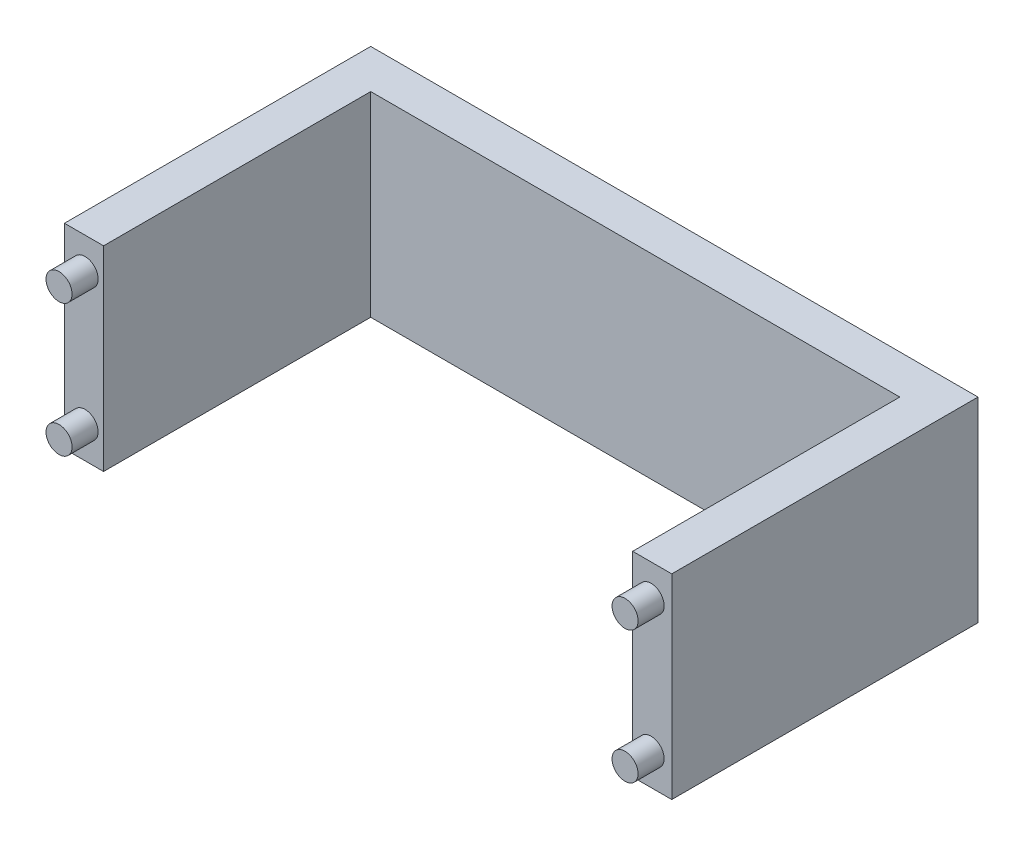
ISO-10303-21;
HEADER;
FILE_DESCRIPTION(('STEP AP214'),'2;1');
FILE_NAME('part.step','',(''),(''),'','','');
FILE_SCHEMA(('AUTOMOTIVE_DESIGN { 1 0 10303 214 1 1 1 1 }'));
ENDSEC;
DATA;
#1=APPLICATION_CONTEXT('core data for automotive mechanical design processes');
#2=APPLICATION_PROTOCOL_DEFINITION('international standard','automotive_design',2000,#1);
#3=PRODUCT_CONTEXT('',#1,'mechanical');
#4=PRODUCT('Part','Part','',(#3));
#5=PRODUCT_RELATED_PRODUCT_CATEGORY('part','',(#4));
#6=PRODUCT_DEFINITION_FORMATION('','',#4);
#7=PRODUCT_DEFINITION_CONTEXT('part definition',#1,'design');
#8=PRODUCT_DEFINITION('design','',#6,#7);
#9=PRODUCT_DEFINITION_SHAPE('','',#8);
#10=(LENGTH_UNIT() NAMED_UNIT(*) SI_UNIT(.MILLI.,.METRE.));
#11=(NAMED_UNIT(*) PLANE_ANGLE_UNIT() SI_UNIT($,.RADIAN.));
#12=(NAMED_UNIT(*) SI_UNIT($,.STERADIAN.) SOLID_ANGLE_UNIT());
#13=UNCERTAINTY_MEASURE_WITH_UNIT(LENGTH_MEASURE(1.E-05),#10,'distance_accuracy_value','');
#14=(GEOMETRIC_REPRESENTATION_CONTEXT(3) GLOBAL_UNCERTAINTY_ASSIGNED_CONTEXT((#13)) GLOBAL_UNIT_ASSIGNED_CONTEXT((#10,
#11,#12)) REPRESENTATION_CONTEXT('',''));
#15=CARTESIAN_POINT('',(0.,0.,0.));
#16=DIRECTION('',(0.,0.,1.));
#17=DIRECTION('',(1.,0.,0.));
#18=AXIS2_PLACEMENT_3D('',#15,#16,#17);
#19=CARTESIAN_POINT('',(3.,15.,0.));
#20=DIRECTION('',(0.,0.,-1.));
#21=DIRECTION('',(-1.,0.,0.));
#22=AXIS2_PLACEMENT_3D('',#19,#20,#21);
#23=PLANE('',#22);
#24=CARTESIAN_POINT('',(1.58299999999999,2.42,0.));
#25=DIRECTION('',(0.,0.,-1.));
#26=DIRECTION('',(-1.,0.,0.));
#27=AXIS2_PLACEMENT_3D('',#24,#25,#26);
#28=CIRCLE('',#27,1.);
#29=CARTESIAN_POINT('',(0.58299999999999,2.42,0.));
#30=VERTEX_POINT('',#29);
#31=EDGE_CURVE('E163',#30,#30,#28,.F.);
#32=ORIENTED_EDGE('',*,*,#31,.F.);
#33=EDGE_LOOP('',(#32));
#34=FACE_BOUND('',#33,.T.);
#35=CARTESIAN_POINT('',(1.58299999999999,12.58,0.));
#36=DIRECTION('',(0.,0.,-1.));
#37=DIRECTION('',(-1.,0.,0.));
#38=AXIS2_PLACEMENT_3D('',#35,#36,#37);
#39=CIRCLE('',#38,1.);
#40=CARTESIAN_POINT('',(0.58299999999999,12.58,0.));
#41=VERTEX_POINT('',#40);
#42=EDGE_CURVE('E160',#41,#41,#39,.F.);
#43=ORIENTED_EDGE('',*,*,#42,.F.);
#44=EDGE_LOOP('',(#43));
#45=FACE_BOUND('',#44,.T.);
#46=DIRECTION('',(1.,0.,0.));
#47=VECTOR('',#46,1.);
#48=CARTESIAN_POINT('',(3.,0.,0.));
#49=LINE('',#48,#47);
#50=CARTESIAN_POINT('',(0.,0.,0.));
#51=VERTEX_POINT('',#50);
#52=CARTESIAN_POINT('',(3.,0.,0.));
#53=VERTEX_POINT('',#52);
#54=EDGE_CURVE('E130',#51,#53,#49,.T.);
#55=ORIENTED_EDGE('',*,*,#54,.T.);
#56=DIRECTION('',(0.,-1.,0.));
#57=VECTOR('',#56,1.);
#58=CARTESIAN_POINT('',(3.,15.,0.));
#59=LINE('',#58,#57);
#60=CARTESIAN_POINT('',(3.,15.,0.));
#61=VERTEX_POINT('',#60);
#62=EDGE_CURVE('E158',#61,#53,#59,.T.);
#63=ORIENTED_EDGE('',*,*,#62,.F.);
#64=DIRECTION('',(1.,0.,0.));
#65=VECTOR('',#64,1.);
#66=CARTESIAN_POINT('',(3.,15.,0.));
#67=LINE('',#66,#65);
#68=CARTESIAN_POINT('',(0.,15.,0.));
#69=VERTEX_POINT('',#68);
#70=EDGE_CURVE('E145',#69,#61,#67,.T.);
#71=ORIENTED_EDGE('',*,*,#70,.F.);
#72=DIRECTION('',(0.,-1.,0.));
#73=VECTOR('',#72,1.);
#74=CARTESIAN_POINT('',(0.,15.,0.));
#75=LINE('',#74,#73);
#76=EDGE_CURVE('E126',#69,#51,#75,.T.);
#77=ORIENTED_EDGE('',*,*,#76,.T.);
#78=EDGE_LOOP('',(#55,#63,#71,#77));
#79=FACE_BOUND('',#78,.T.);
#80=ADVANCED_FACE('F33',(#34,#45,#79),#23,.F.);
#81=CARTESIAN_POINT('',(3.,15.,-20.5));
#82=DIRECTION('',(-1.,0.,0.));
#83=DIRECTION('',(0.,0.,1.));
#84=AXIS2_PLACEMENT_3D('',#81,#82,#83);
#85=PLANE('',#84);
#86=DIRECTION('',(0.,0.,-1.));
#87=VECTOR('',#86,1.);
#88=CARTESIAN_POINT('',(3.,0.,-20.5));
#89=LINE('',#88,#87);
#90=CARTESIAN_POINT('',(3.,0.,-20.5));
#91=VERTEX_POINT('',#90);
#92=EDGE_CURVE('E133',#53,#91,#89,.T.);
#93=ORIENTED_EDGE('',*,*,#92,.T.);
#94=DIRECTION('',(0.,-1.,0.));
#95=VECTOR('',#94,1.);
#96=CARTESIAN_POINT('',(3.,15.,-20.5));
#97=LINE('',#96,#95);
#98=CARTESIAN_POINT('',(3.,15.,-20.5));
#99=VERTEX_POINT('',#98);
#100=EDGE_CURVE('E155',#99,#91,#97,.T.);
#101=ORIENTED_EDGE('',*,*,#100,.F.);
#102=DIRECTION('',(0.,0.,-1.));
#103=VECTOR('',#102,1.);
#104=CARTESIAN_POINT('',(3.,15.,-20.5));
#105=LINE('',#104,#103);
#106=EDGE_CURVE('E93',#61,#99,#105,.T.);
#107=ORIENTED_EDGE('',*,*,#106,.F.);
#108=ORIENTED_EDGE('',*,*,#62,.T.);
#109=EDGE_LOOP('',(#93,#101,#107,#108));
#110=FACE_BOUND('',#109,.T.);
#111=ADVANCED_FACE('F197',(#110),#85,.F.);
#112=CARTESIAN_POINT('',(43.6,15.,-20.5));
#113=DIRECTION('',(0.,0.,-1.));
#114=DIRECTION('',(-1.,0.,0.));
#115=AXIS2_PLACEMENT_3D('',#112,#113,#114);
#116=PLANE('',#115);
#117=DIRECTION('',(1.,0.,0.));
#118=VECTOR('',#117,1.);
#119=CARTESIAN_POINT('',(43.6,0.,-20.5));
#120=LINE('',#119,#118);
#121=CARTESIAN_POINT('',(43.6,0.,-20.5));
#122=VERTEX_POINT('',#121);
#123=EDGE_CURVE('E136',#91,#122,#120,.T.);
#124=ORIENTED_EDGE('',*,*,#123,.T.);
#125=DIRECTION('',(0.,-1.,0.));
#126=VECTOR('',#125,1.);
#127=CARTESIAN_POINT('',(43.6,15.,-20.5));
#128=LINE('',#127,#126);
#129=CARTESIAN_POINT('',(43.6,15.,-20.5));
#130=VERTEX_POINT('',#129);
#131=EDGE_CURVE('E152',#130,#122,#128,.T.);
#132=ORIENTED_EDGE('',*,*,#131,.F.);
#133=DIRECTION('',(1.,0.,0.));
#134=VECTOR('',#133,1.);
#135=CARTESIAN_POINT('',(43.6,15.,-20.5));
#136=LINE('',#135,#134);
#137=EDGE_CURVE('E262',#99,#130,#136,.T.);
#138=ORIENTED_EDGE('',*,*,#137,.F.);
#139=ORIENTED_EDGE('',*,*,#100,.T.);
#140=EDGE_LOOP('',(#124,#132,#138,#139));
#141=FACE_BOUND('',#140,.T.);
#142=ADVANCED_FACE('F203',(#141),#116,.F.);
#143=CARTESIAN_POINT('',(43.6,15.,0.));
#144=DIRECTION('',(1.,0.,0.));
#145=DIRECTION('',(0.,0.,-1.));
#146=AXIS2_PLACEMENT_3D('',#143,#144,#145);
#147=PLANE('',#146);
#148=DIRECTION('',(0.,0.,1.));
#149=VECTOR('',#148,1.);
#150=CARTESIAN_POINT('',(43.6,0.,0.));
#151=LINE('',#150,#149);
#152=CARTESIAN_POINT('',(43.6,0.,0.));
#153=VERTEX_POINT('',#152);
#154=EDGE_CURVE('E138',#122,#153,#151,.T.);
#155=ORIENTED_EDGE('',*,*,#154,.T.);
#156=DIRECTION('',(0.,-1.,0.));
#157=VECTOR('',#156,1.);
#158=CARTESIAN_POINT('',(43.6,15.,0.));
#159=LINE('',#158,#157);
#160=CARTESIAN_POINT('',(43.6,15.,0.));
#161=VERTEX_POINT('',#160);
#162=EDGE_CURVE('E149',#161,#153,#159,.T.);
#163=ORIENTED_EDGE('',*,*,#162,.F.);
#164=DIRECTION('',(0.,0.,1.));
#165=VECTOR('',#164,1.);
#166=CARTESIAN_POINT('',(43.6,15.,0.));
#167=LINE('',#166,#165);
#168=EDGE_CURVE('E264',#130,#161,#167,.T.);
#169=ORIENTED_EDGE('',*,*,#168,.F.);
#170=ORIENTED_EDGE('',*,*,#131,.T.);
#171=EDGE_LOOP('',(#155,#163,#169,#170));
#172=FACE_BOUND('',#171,.T.);
#173=ADVANCED_FACE('F173',(#172),#147,.F.);
#174=CARTESIAN_POINT('',(46.6,15.,0.));
#175=DIRECTION('',(0.,0.,-1.));
#176=DIRECTION('',(-1.,0.,0.));
#177=AXIS2_PLACEMENT_3D('',#174,#175,#176);
#178=PLANE('',#177);
#179=CARTESIAN_POINT('',(45.017,12.58,0.));
#180=DIRECTION('',(0.,0.,-1.));
#181=DIRECTION('',(-1.,0.,0.));
#182=AXIS2_PLACEMENT_3D('',#179,#180,#181);
#183=CIRCLE('',#182,0.999999999999998);
#184=CARTESIAN_POINT('',(44.017,12.58,0.));
#185=VERTEX_POINT('',#184);
#186=EDGE_CURVE('E11',#185,#185,#183,.F.);
#187=ORIENTED_EDGE('',*,*,#186,.F.);
#188=EDGE_LOOP('',(#187));
#189=FACE_BOUND('',#188,.T.);
#190=CARTESIAN_POINT('',(45.017,2.42,0.));
#191=DIRECTION('',(0.,0.,-1.));
#192=DIRECTION('',(-1.,0.,0.));
#193=AXIS2_PLACEMENT_3D('',#190,#191,#192);
#194=CIRCLE('',#193,0.999999999999998);
#195=CARTESIAN_POINT('',(44.017,2.42,0.));
#196=VERTEX_POINT('',#195);
#197=EDGE_CURVE('E41',#196,#196,#194,.F.);
#198=ORIENTED_EDGE('',*,*,#197,.F.);
#199=EDGE_LOOP('',(#198));
#200=FACE_BOUND('',#199,.T.);
#201=DIRECTION('',(1.,0.,0.));
#202=VECTOR('',#201,1.);
#203=CARTESIAN_POINT('',(46.6,0.,0.));
#204=LINE('',#203,#202);
#205=CARTESIAN_POINT('',(46.6,0.,0.));
#206=VERTEX_POINT('',#205);
#207=EDGE_CURVE('E140',#153,#206,#204,.T.);
#208=ORIENTED_EDGE('',*,*,#207,.T.);
#209=DIRECTION('',(0.,-1.,0.));
#210=VECTOR('',#209,1.);
#211=CARTESIAN_POINT('',(46.6,15.,0.));
#212=LINE('',#211,#210);
#213=CARTESIAN_POINT('',(46.6,15.,0.));
#214=VERTEX_POINT('',#213);
#215=EDGE_CURVE('E121',#214,#206,#212,.T.);
#216=ORIENTED_EDGE('',*,*,#215,.F.);
#217=DIRECTION('',(1.,0.,0.));
#218=VECTOR('',#217,1.);
#219=CARTESIAN_POINT('',(46.6,15.,0.));
#220=LINE('',#219,#218);
#221=EDGE_CURVE('E112',#161,#214,#220,.T.);
#222=ORIENTED_EDGE('',*,*,#221,.F.);
#223=ORIENTED_EDGE('',*,*,#162,.T.);
#224=EDGE_LOOP('',(#208,#216,#222,#223));
#225=FACE_BOUND('',#224,.T.);
#226=ADVANCED_FACE('F170',(#189,#200,#225),#178,.F.);
#227=CARTESIAN_POINT('',(46.6,15.,-23.5));
#228=DIRECTION('',(-1.,0.,0.));
#229=DIRECTION('',(0.,0.,1.));
#230=AXIS2_PLACEMENT_3D('',#227,#228,#229);
#231=PLANE('',#230);
#232=DIRECTION('',(0.,0.,-1.));
#233=VECTOR('',#232,1.);
#234=CARTESIAN_POINT('',(46.6,0.,-23.5));
#235=LINE('',#234,#233);
#236=CARTESIAN_POINT('',(46.6,0.,-23.5));
#237=VERTEX_POINT('',#236);
#238=EDGE_CURVE('E120',#206,#237,#235,.T.);
#239=ORIENTED_EDGE('',*,*,#238,.T.);
#240=DIRECTION('',(0.,-1.,0.));
#241=VECTOR('',#240,1.);
#242=CARTESIAN_POINT('',(46.6,15.,-23.5));
#243=LINE('',#242,#241);
#244=CARTESIAN_POINT('',(46.6,15.,-23.5));
#245=VERTEX_POINT('',#244);
#246=EDGE_CURVE('E117',#245,#237,#243,.T.);
#247=ORIENTED_EDGE('',*,*,#246,.F.);
#248=DIRECTION('',(0.,0.,-1.));
#249=VECTOR('',#248,1.);
#250=CARTESIAN_POINT('',(46.6,15.,-23.5));
#251=LINE('',#250,#249);
#252=EDGE_CURVE('E106',#214,#245,#251,.T.);
#253=ORIENTED_EDGE('',*,*,#252,.F.);
#254=ORIENTED_EDGE('',*,*,#215,.T.);
#255=EDGE_LOOP('',(#239,#247,#253,#254));
#256=FACE_BOUND('',#255,.T.);
#257=ADVANCED_FACE('F118',(#256),#231,.F.);
#258=CARTESIAN_POINT('',(0.,15.,-23.5));
#259=DIRECTION('',(0.,0.,1.));
#260=DIRECTION('',(1.,0.,0.));
#261=AXIS2_PLACEMENT_3D('',#258,#259,#260);
#262=PLANE('',#261);
#263=DIRECTION('',(-1.,0.,0.));
#264=VECTOR('',#263,1.);
#265=CARTESIAN_POINT('',(0.,0.,-23.5));
#266=LINE('',#265,#264);
#267=CARTESIAN_POINT('',(0.,0.,-23.5));
#268=VERTEX_POINT('',#267);
#269=EDGE_CURVE('E78',#237,#268,#266,.T.);
#270=ORIENTED_EDGE('',*,*,#269,.T.);
#271=DIRECTION('',(0.,-1.,0.));
#272=VECTOR('',#271,1.);
#273=CARTESIAN_POINT('',(0.,15.,-23.5));
#274=LINE('',#273,#272);
#275=CARTESIAN_POINT('',(0.,15.,-23.5));
#276=VERTEX_POINT('',#275);
#277=EDGE_CURVE('E122',#276,#268,#274,.T.);
#278=ORIENTED_EDGE('',*,*,#277,.F.);
#279=DIRECTION('',(-1.,0.,0.));
#280=VECTOR('',#279,1.);
#281=CARTESIAN_POINT('',(0.,15.,-23.5));
#282=LINE('',#281,#280);
#283=EDGE_CURVE('E110',#245,#276,#282,.T.);
#284=ORIENTED_EDGE('',*,*,#283,.F.);
#285=ORIENTED_EDGE('',*,*,#246,.T.);
#286=EDGE_LOOP('',(#270,#278,#284,#285));
#287=FACE_BOUND('',#286,.T.);
#288=ADVANCED_FACE('F124',(#287),#262,.F.);
#289=CARTESIAN_POINT('',(0.,15.,0.));
#290=DIRECTION('',(1.,0.,0.));
#291=DIRECTION('',(0.,0.,-1.));
#292=AXIS2_PLACEMENT_3D('',#289,#290,#291);
#293=PLANE('',#292);
#294=DIRECTION('',(0.,0.,1.));
#295=VECTOR('',#294,1.);
#296=CARTESIAN_POINT('',(0.,0.,0.));
#297=LINE('',#296,#295);
#298=EDGE_CURVE('E84',#268,#51,#297,.T.);
#299=ORIENTED_EDGE('',*,*,#298,.T.);
#300=ORIENTED_EDGE('',*,*,#76,.F.);
#301=DIRECTION('',(0.,0.,1.));
#302=VECTOR('',#301,1.);
#303=CARTESIAN_POINT('',(0.,15.,0.));
#304=LINE('',#303,#302);
#305=EDGE_CURVE('E49',#276,#69,#304,.T.);
#306=ORIENTED_EDGE('',*,*,#305,.F.);
#307=ORIENTED_EDGE('',*,*,#277,.T.);
#308=EDGE_LOOP('',(#299,#300,#306,#307));
#309=FACE_BOUND('',#308,.T.);
#310=ADVANCED_FACE('F186',(#309),#293,.F.);
#311=CARTESIAN_POINT('',(0.,15.,0.));
#312=DIRECTION('',(0.,-1.,0.));
#313=DIRECTION('',(0.,0.,-1.));
#314=AXIS2_PLACEMENT_3D('',#311,#312,#313);
#315=PLANE('',#314);
#316=ORIENTED_EDGE('',*,*,#70,.T.);
#317=ORIENTED_EDGE('',*,*,#106,.T.);
#318=ORIENTED_EDGE('',*,*,#137,.T.);
#319=ORIENTED_EDGE('',*,*,#168,.T.);
#320=ORIENTED_EDGE('',*,*,#221,.T.);
#321=ORIENTED_EDGE('',*,*,#252,.T.);
#322=ORIENTED_EDGE('',*,*,#283,.T.);
#323=ORIENTED_EDGE('',*,*,#305,.T.);
#324=EDGE_LOOP('',(#316,#317,#318,#319,#320,#321,#322,#323));
#325=FACE_BOUND('',#324,.T.);
#326=ADVANCED_FACE('F108',(#325),#315,.F.);
#327=CARTESIAN_POINT('',(0.,0.,0.));
#328=DIRECTION('',(0.,-1.,0.));
#329=DIRECTION('',(0.,0.,-1.));
#330=AXIS2_PLACEMENT_3D('',#327,#328,#329);
#331=PLANE('',#330);
#332=ORIENTED_EDGE('',*,*,#54,.F.);
#333=ORIENTED_EDGE('',*,*,#298,.F.);
#334=ORIENTED_EDGE('',*,*,#269,.F.);
#335=ORIENTED_EDGE('',*,*,#238,.F.);
#336=ORIENTED_EDGE('',*,*,#207,.F.);
#337=ORIENTED_EDGE('',*,*,#154,.F.);
#338=ORIENTED_EDGE('',*,*,#123,.F.);
#339=ORIENTED_EDGE('',*,*,#92,.F.);
#340=EDGE_LOOP('',(#332,#333,#334,#335,#336,#337,#338,#339));
#341=FACE_BOUND('',#340,.T.);
#342=ADVANCED_FACE('F181',(#341),#331,.T.);
#343=CARTESIAN_POINT('',(1.58299999999999,12.58,2.));
#344=DIRECTION('',(0.,0.,-1.));
#345=DIRECTION('',(-1.,0.,0.));
#346=AXIS2_PLACEMENT_3D('',#343,#344,#345);
#347=CYLINDRICAL_SURFACE('',#346,1.);
#348=CARTESIAN_POINT('',(1.58299999999999,12.58,2.));
#349=DIRECTION('',(0.,0.,1.));
#350=DIRECTION('',(1.,0.,0.));
#351=AXIS2_PLACEMENT_3D('',#348,#349,#350);
#352=CIRCLE('',#351,1.);
#353=CARTESIAN_POINT('',(2.58299999999999,12.58,2.));
#354=VERTEX_POINT('',#353);
#355=EDGE_CURVE('E134',#354,#354,#352,.T.);
#356=ORIENTED_EDGE('',*,*,#355,.F.);
#357=EDGE_LOOP('',(#356));
#358=FACE_BOUND('',#357,.T.);
#359=ORIENTED_EDGE('',*,*,#42,.T.);
#360=EDGE_LOOP('',(#359));
#361=FACE_BOUND('',#360,.T.);
#362=ADVANCED_FACE('F208',(#358,#361),#347,.T.);
#363=CARTESIAN_POINT('',(1.58299999999999,12.58,2.));
#364=DIRECTION('',(0.,0.,1.));
#365=DIRECTION('',(1.,0.,0.));
#366=AXIS2_PLACEMENT_3D('',#363,#364,#365);
#367=PLANE('',#366);
#368=ORIENTED_EDGE('',*,*,#355,.T.);
#369=EDGE_LOOP('',(#368));
#370=FACE_BOUND('',#369,.T.);
#371=ADVANCED_FACE('F210',(#370),#367,.T.);
#372=CARTESIAN_POINT('',(1.58299999999999,2.42,2.));
#373=DIRECTION('',(0.,0.,-1.));
#374=DIRECTION('',(-1.,0.,0.));
#375=AXIS2_PLACEMENT_3D('',#372,#373,#374);
#376=CYLINDRICAL_SURFACE('',#375,1.);
#377=CARTESIAN_POINT('',(1.58299999999999,2.42,2.));
#378=DIRECTION('',(0.,0.,1.));
#379=DIRECTION('',(1.,0.,0.));
#380=AXIS2_PLACEMENT_3D('',#377,#378,#379);
#381=CIRCLE('',#380,1.);
#382=CARTESIAN_POINT('',(2.58299999999999,2.42,2.));
#383=VERTEX_POINT('',#382);
#384=EDGE_CURVE('E253',#383,#383,#381,.T.);
#385=ORIENTED_EDGE('',*,*,#384,.F.);
#386=EDGE_LOOP('',(#385));
#387=FACE_BOUND('',#386,.T.);
#388=ORIENTED_EDGE('',*,*,#31,.T.);
#389=EDGE_LOOP('',(#388));
#390=FACE_BOUND('',#389,.T.);
#391=ADVANCED_FACE('F217',(#387,#390),#376,.T.);
#392=CARTESIAN_POINT('',(1.58299999999999,2.42,2.));
#393=DIRECTION('',(0.,0.,1.));
#394=DIRECTION('',(1.,0.,0.));
#395=AXIS2_PLACEMENT_3D('',#392,#393,#394);
#396=PLANE('',#395);
#397=ORIENTED_EDGE('',*,*,#384,.T.);
#398=EDGE_LOOP('',(#397));
#399=FACE_BOUND('',#398,.T.);
#400=ADVANCED_FACE('F222',(#399),#396,.T.);
#401=CARTESIAN_POINT('',(45.017,2.42,2.));
#402=DIRECTION('',(0.,0.,-1.));
#403=DIRECTION('',(-1.,0.,0.));
#404=AXIS2_PLACEMENT_3D('',#401,#402,#403);
#405=CYLINDRICAL_SURFACE('',#404,0.999999999999998);
#406=CARTESIAN_POINT('',(45.017,2.42,2.));
#407=DIRECTION('',(0.,0.,1.));
#408=DIRECTION('',(1.,0.,0.));
#409=AXIS2_PLACEMENT_3D('',#406,#407,#408);
#410=CIRCLE('',#409,0.999999999999998);
#411=CARTESIAN_POINT('',(46.017,2.42,2.));
#412=VERTEX_POINT('',#411);
#413=EDGE_CURVE('E250',#412,#412,#410,.T.);
#414=ORIENTED_EDGE('',*,*,#413,.F.);
#415=EDGE_LOOP('',(#414));
#416=FACE_BOUND('',#415,.T.);
#417=ORIENTED_EDGE('',*,*,#197,.T.);
#418=EDGE_LOOP('',(#417));
#419=FACE_BOUND('',#418,.T.);
#420=ADVANCED_FACE('F168',(#416,#419),#405,.T.);
#421=CARTESIAN_POINT('',(45.017,2.42,2.));
#422=DIRECTION('',(0.,0.,1.));
#423=DIRECTION('',(1.,0.,0.));
#424=AXIS2_PLACEMENT_3D('',#421,#422,#423);
#425=PLANE('',#424);
#426=ORIENTED_EDGE('',*,*,#413,.T.);
#427=EDGE_LOOP('',(#426));
#428=FACE_BOUND('',#427,.T.);
#429=ADVANCED_FACE('F229',(#428),#425,.T.);
#430=CARTESIAN_POINT('',(45.017,12.58,2.));
#431=DIRECTION('',(0.,0.,-1.));
#432=DIRECTION('',(-1.,0.,0.));
#433=AXIS2_PLACEMENT_3D('',#430,#431,#432);
#434=CYLINDRICAL_SURFACE('',#433,0.999999999999998);
#435=CARTESIAN_POINT('',(45.017,12.58,2.));
#436=DIRECTION('',(0.,0.,1.));
#437=DIRECTION('',(1.,0.,0.));
#438=AXIS2_PLACEMENT_3D('',#435,#436,#437);
#439=CIRCLE('',#438,0.999999999999998);
#440=CARTESIAN_POINT('',(46.017,12.58,2.));
#441=VERTEX_POINT('',#440);
#442=EDGE_CURVE('E248',#441,#441,#439,.T.);
#443=ORIENTED_EDGE('',*,*,#442,.F.);
#444=EDGE_LOOP('',(#443));
#445=FACE_BOUND('',#444,.T.);
#446=ORIENTED_EDGE('',*,*,#186,.T.);
#447=EDGE_LOOP('',(#446));
#448=FACE_BOUND('',#447,.T.);
#449=ADVANCED_FACE('F232',(#445,#448),#434,.T.);
#450=CARTESIAN_POINT('',(45.017,12.58,2.));
#451=DIRECTION('',(0.,0.,1.));
#452=DIRECTION('',(1.,0.,0.));
#453=AXIS2_PLACEMENT_3D('',#450,#451,#452);
#454=PLANE('',#453);
#455=ORIENTED_EDGE('',*,*,#442,.T.);
#456=EDGE_LOOP('',(#455));
#457=FACE_BOUND('',#456,.T.);
#458=ADVANCED_FACE('F237',(#457),#454,.T.);
#459=CLOSED_SHELL('',(#80,#111,#142,#173,#226,#257,#288,#310,#326,#342,#362,#371,#391,#400,#420,
#429,#449,#458));
#460=MANIFOLD_SOLID_BREP('B2',#459);
#461=ADVANCED_BREP_SHAPE_REPRESENTATION('',(#18,#460),#14);
#462=SHAPE_DEFINITION_REPRESENTATION(#9,#461);
ENDSEC;
END-ISO-10303-21;
